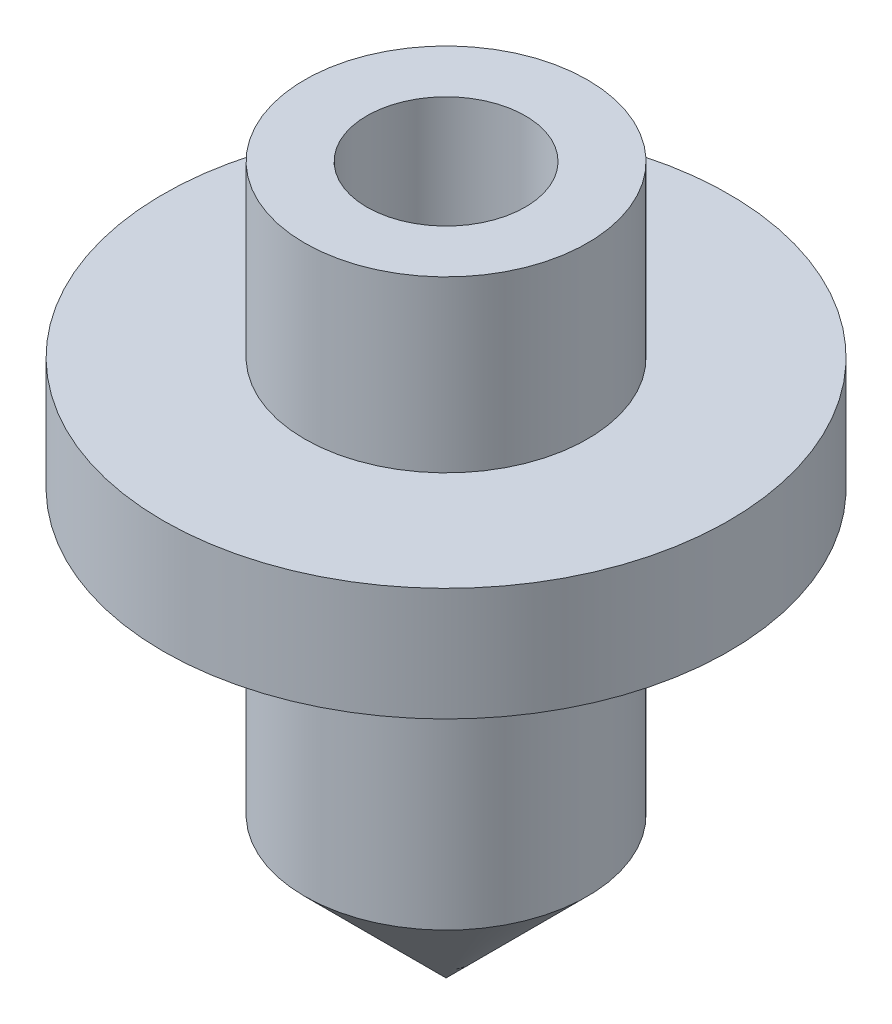
ISO-10303-21;
HEADER;
FILE_DESCRIPTION(('STEP AP214'),'2;1');
FILE_NAME('part.step','',(''),(''),'','','');
FILE_SCHEMA(('AUTOMOTIVE_DESIGN { 1 0 10303 214 1 1 1 1 }'));
ENDSEC;
DATA;
#1=APPLICATION_CONTEXT('core data for automotive mechanical design processes');
#2=APPLICATION_PROTOCOL_DEFINITION('international standard','automotive_design',2000,#1);
#3=PRODUCT_CONTEXT('',#1,'mechanical');
#4=PRODUCT('Part','Part','',(#3));
#5=PRODUCT_RELATED_PRODUCT_CATEGORY('part','',(#4));
#6=PRODUCT_DEFINITION_FORMATION('','',#4);
#7=PRODUCT_DEFINITION_CONTEXT('part definition',#1,'design');
#8=PRODUCT_DEFINITION('design','',#6,#7);
#9=PRODUCT_DEFINITION_SHAPE('','',#8);
#10=(LENGTH_UNIT() NAMED_UNIT(*) SI_UNIT(.MILLI.,.METRE.));
#11=(NAMED_UNIT(*) PLANE_ANGLE_UNIT() SI_UNIT($,.RADIAN.));
#12=(NAMED_UNIT(*) SI_UNIT($,.STERADIAN.) SOLID_ANGLE_UNIT());
#13=UNCERTAINTY_MEASURE_WITH_UNIT(LENGTH_MEASURE(1.E-05),#10,'distance_accuracy_value','');
#14=(GEOMETRIC_REPRESENTATION_CONTEXT(3) GLOBAL_UNCERTAINTY_ASSIGNED_CONTEXT((#13)) GLOBAL_UNIT_ASSIGNED_CONTEXT((#10,
#11,#12)) REPRESENTATION_CONTEXT('',''));
#15=CARTESIAN_POINT('',(0.,0.,0.));
#16=DIRECTION('',(0.,0.,1.));
#17=DIRECTION('',(1.,0.,0.));
#18=AXIS2_PLACEMENT_3D('',#15,#16,#17);
#19=CARTESIAN_POINT('',(0.,21.4718539611851,25.));
#20=DIRECTION('',(0.,-1.,0.));
#21=DIRECTION('',(0.,0.,-1.));
#22=AXIS2_PLACEMENT_3D('',#19,#20,#21);
#23=PLANE('',#22);
#24=CARTESIAN_POINT('',(0.,21.4718539611851,0.));
#25=DIRECTION('',(0.,1.,0.));
#26=DIRECTION('',(0.,0.,1.));
#27=AXIS2_PLACEMENT_3D('',#24,#25,#26);
#28=CIRCLE('',#27,25.);
#29=CARTESIAN_POINT('',(0.,21.4718539611851,25.));
#30=VERTEX_POINT('',#29);
#31=EDGE_CURVE('E53',#30,#30,#28,.T.);
#32=ORIENTED_EDGE('',*,*,#31,.T.);
#33=EDGE_LOOP('',(#32));
#34=FACE_BOUND('',#33,.T.);
#35=CARTESIAN_POINT('',(0.,21.4718539611851,0.));
#36=DIRECTION('',(0.,1.,0.));
#37=DIRECTION('',(0.,0.,1.));
#38=AXIS2_PLACEMENT_3D('',#35,#36,#37);
#39=CIRCLE('',#38,50.);
#40=CARTESIAN_POINT('',(0.,21.4718539611851,50.));
#41=VERTEX_POINT('',#40);
#42=EDGE_CURVE('E11',#41,#41,#39,.T.);
#43=ORIENTED_EDGE('',*,*,#42,.F.);
#44=EDGE_LOOP('',(#43));
#45=FACE_BOUND('',#44,.T.);
#46=ADVANCED_FACE('F33',(#34,#45),#23,.T.);
#47=CARTESIAN_POINT('',(0.,58.1389893948846,0.));
#48=DIRECTION('',(0.,1.,0.));
#49=DIRECTION('',(0.,0.,1.));
#50=AXIS2_PLACEMENT_3D('',#47,#48,#49);
#51=CYLINDRICAL_SURFACE('',#50,50.);
#52=ORIENTED_EDGE('',*,*,#42,.T.);
#53=EDGE_LOOP('',(#52));
#54=FACE_BOUND('',#53,.T.);
#55=CARTESIAN_POINT('',(0.,41.4718539611851,0.));
#56=DIRECTION('',(0.,1.,0.));
#57=DIRECTION('',(0.,0.,1.));
#58=AXIS2_PLACEMENT_3D('',#55,#56,#57);
#59=CIRCLE('',#58,50.);
#60=CARTESIAN_POINT('',(0.,41.4718539611851,50.));
#61=VERTEX_POINT('',#60);
#62=EDGE_CURVE('E39',#61,#61,#59,.T.);
#63=ORIENTED_EDGE('',*,*,#62,.F.);
#64=EDGE_LOOP('',(#63));
#65=FACE_BOUND('',#64,.T.);
#66=ADVANCED_FACE('F74',(#54,#65),#51,.T.);
#67=CARTESIAN_POINT('',(0.,41.4718539611851,50.));
#68=DIRECTION('',(0.,1.,0.));
#69=DIRECTION('',(0.,0.,1.));
#70=AXIS2_PLACEMENT_3D('',#67,#68,#69);
#71=PLANE('',#70);
#72=ORIENTED_EDGE('',*,*,#62,.T.);
#73=EDGE_LOOP('',(#72));
#74=FACE_BOUND('',#73,.T.);
#75=CARTESIAN_POINT('',(0.,41.4718539611851,0.));
#76=DIRECTION('',(0.,1.,0.));
#77=DIRECTION('',(0.,0.,1.));
#78=AXIS2_PLACEMENT_3D('',#75,#76,#77);
#79=CIRCLE('',#78,25.);
#80=CARTESIAN_POINT('',(0.,41.4718539611851,25.));
#81=VERTEX_POINT('',#80);
#82=EDGE_CURVE('E66',#81,#81,#79,.T.);
#83=ORIENTED_EDGE('',*,*,#82,.F.);
#84=EDGE_LOOP('',(#83));
#85=FACE_BOUND('',#84,.T.);
#86=ADVANCED_FACE('F71',(#74,#85),#71,.T.);
#87=CARTESIAN_POINT('',(0.,58.1389893948846,0.));
#88=DIRECTION('',(0.,1.,0.));
#89=DIRECTION('',(0.,0.,1.));
#90=AXIS2_PLACEMENT_3D('',#87,#88,#89);
#91=CYLINDRICAL_SURFACE('',#90,25.);
#92=ORIENTED_EDGE('',*,*,#82,.T.);
#93=EDGE_LOOP('',(#92));
#94=FACE_BOUND('',#93,.T.);
#95=CARTESIAN_POINT('',(0.,71.471853961185,0.));
#96=DIRECTION('',(0.,1.,0.));
#97=DIRECTION('',(0.,0.,1.));
#98=AXIS2_PLACEMENT_3D('',#95,#96,#97);
#99=CIRCLE('',#98,25.);
#100=CARTESIAN_POINT('',(0.,71.471853961185,25.));
#101=VERTEX_POINT('',#100);
#102=EDGE_CURVE('E63',#101,#101,#99,.T.);
#103=ORIENTED_EDGE('',*,*,#102,.F.);
#104=EDGE_LOOP('',(#103));
#105=FACE_BOUND('',#104,.T.);
#106=ADVANCED_FACE('F81',(#94,#105),#91,.T.);
#107=CARTESIAN_POINT('',(0.,71.471853961185,25.));
#108=DIRECTION('',(0.,1.,0.));
#109=DIRECTION('',(0.,0.,1.));
#110=AXIS2_PLACEMENT_3D('',#107,#108,#109);
#111=PLANE('',#110);
#112=ORIENTED_EDGE('',*,*,#102,.T.);
#113=EDGE_LOOP('',(#112));
#114=FACE_BOUND('',#113,.T.);
#115=CARTESIAN_POINT('',(0.,71.471853961185,0.));
#116=DIRECTION('',(0.,1.,0.));
#117=DIRECTION('',(0.,0.,1.));
#118=AXIS2_PLACEMENT_3D('',#115,#116,#117);
#119=CIRCLE('',#118,14.);
#120=CARTESIAN_POINT('',(0.,71.471853961185,14.));
#121=VERTEX_POINT('',#120);
#122=EDGE_CURVE('E56',#121,#121,#119,.T.);
#123=ORIENTED_EDGE('',*,*,#122,.F.);
#124=EDGE_LOOP('',(#123));
#125=FACE_BOUND('',#124,.T.);
#126=ADVANCED_FACE('F87',(#114,#125),#111,.T.);
#127=CARTESIAN_POINT('',(0.,58.1389893948846,0.));
#128=DIRECTION('',(0.,1.,0.));
#129=DIRECTION('',(0.,0.,1.));
#130=AXIS2_PLACEMENT_3D('',#127,#128,#129);
#131=CYLINDRICAL_SURFACE('',#130,14.);
#132=ORIENTED_EDGE('',*,*,#122,.T.);
#133=EDGE_LOOP('',(#132));
#134=FACE_BOUND('',#133,.T.);
#135=CARTESIAN_POINT('',(0.,-28.5281460388149,0.));
#136=DIRECTION('',(0.,1.,0.));
#137=DIRECTION('',(0.,0.,1.));
#138=AXIS2_PLACEMENT_3D('',#135,#136,#137);
#139=CIRCLE('',#138,14.);
#140=CARTESIAN_POINT('',(0.,-28.5281460388149,14.));
#141=VERTEX_POINT('',#140);
#142=EDGE_CURVE('E52',#141,#141,#139,.T.);
#143=ORIENTED_EDGE('',*,*,#142,.F.);
#144=EDGE_LOOP('',(#143));
#145=FACE_BOUND('',#144,.T.);
#146=ADVANCED_FACE('F91',(#134,#145),#131,.F.);
#147=CARTESIAN_POINT('',(0.,-28.5281460388149,14.));
#148=DIRECTION('',(0.,1.,0.));
#149=DIRECTION('',(0.,0.,1.));
#150=AXIS2_PLACEMENT_3D('',#147,#148,#149);
#151=PLANE('',#150);
#152=ORIENTED_EDGE('',*,*,#142,.T.);
#153=EDGE_LOOP('',(#152));
#154=FACE_BOUND('',#153,.T.);
#155=ADVANCED_FACE('F46',(#154),#151,.T.);
#156=CARTESIAN_POINT('',(0.,-28.5281460388149,0.));
#157=DIRECTION('',(0.,1.,0.));
#158=DIRECTION('',(0.,0.,1.));
#159=AXIS2_PLACEMENT_3D('',#156,#157,#158);
#160=CONICAL_SURFACE('',#159,25.,0.78539816339745);
#161=CARTESIAN_POINT('',(0.,-53.5281460388148,0.));
#162=VERTEX_POINT('',#161);
#163=VERTEX_LOOP('',#162);
#164=FACE_BOUND('',#163,.T.);
#165=CARTESIAN_POINT('',(0.,-28.5281460388149,0.));
#166=DIRECTION('',(0.,1.,0.));
#167=DIRECTION('',(0.,0.,1.));
#168=AXIS2_PLACEMENT_3D('',#165,#166,#167);
#169=CIRCLE('',#168,25.);
#170=CARTESIAN_POINT('',(0.,-28.5281460388149,25.));
#171=VERTEX_POINT('',#170);
#172=EDGE_CURVE('E50',#171,#171,#169,.T.);
#173=ORIENTED_EDGE('',*,*,#172,.F.);
#174=EDGE_LOOP('',(#173));
#175=FACE_BOUND('',#174,.T.);
#176=ADVANCED_FACE('F42',(#164,#175),#160,.T.);
#177=CARTESIAN_POINT('',(0.,58.1389893948846,0.));
#178=DIRECTION('',(0.,1.,0.));
#179=DIRECTION('',(0.,0.,1.));
#180=AXIS2_PLACEMENT_3D('',#177,#178,#179);
#181=CYLINDRICAL_SURFACE('',#180,25.);
#182=ORIENTED_EDGE('',*,*,#172,.T.);
#183=EDGE_LOOP('',(#182));
#184=FACE_BOUND('',#183,.T.);
#185=ORIENTED_EDGE('',*,*,#31,.F.);
#186=EDGE_LOOP('',(#185));
#187=FACE_BOUND('',#186,.T.);
#188=ADVANCED_FACE('F45',(#184,#187),#181,.T.);
#189=CLOSED_SHELL('',(#46,#66,#86,#106,#126,#146,#155,#176,#188));
#190=MANIFOLD_SOLID_BREP('B2',#189);
#191=ADVANCED_BREP_SHAPE_REPRESENTATION('',(#18,#190),#14);
#192=SHAPE_DEFINITION_REPRESENTATION(#9,#191);
ENDSEC;
END-ISO-10303-21;
